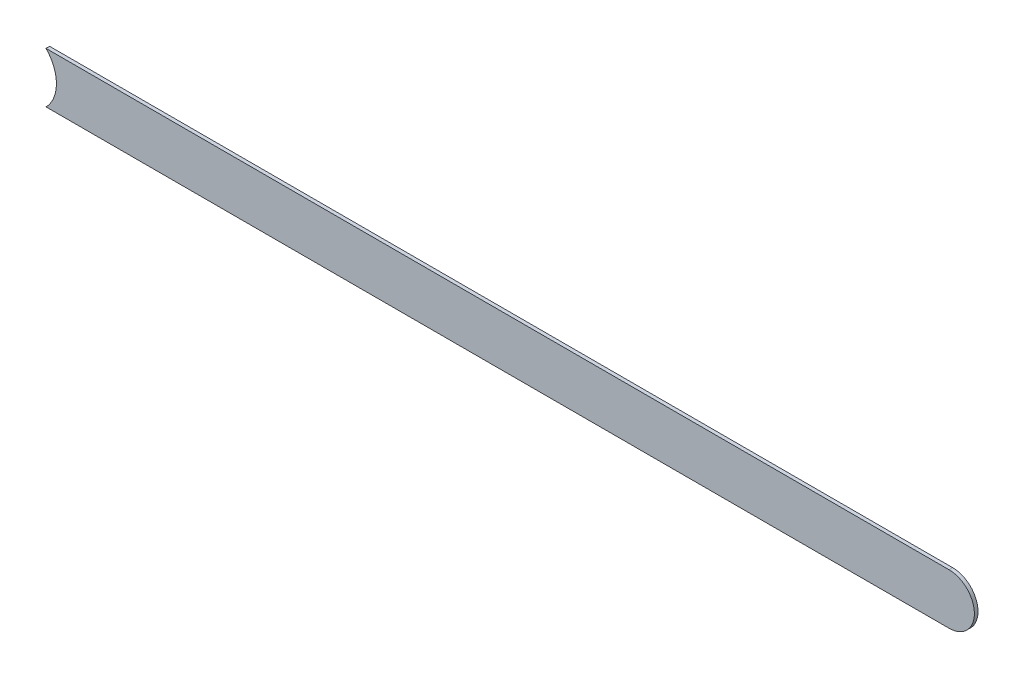
ISO-10303-21;
HEADER;
FILE_DESCRIPTION(('STEP AP214'),'2;1');
FILE_NAME('part.step','',(''),(''),'','','');
FILE_SCHEMA(('AUTOMOTIVE_DESIGN { 1 0 10303 214 1 1 1 1 }'));
ENDSEC;
DATA;
#1=APPLICATION_CONTEXT('core data for automotive mechanical design processes');
#2=APPLICATION_PROTOCOL_DEFINITION('international standard','automotive_design',2000,#1);
#3=PRODUCT_CONTEXT('',#1,'mechanical');
#4=PRODUCT('Part','Part','',(#3));
#5=PRODUCT_RELATED_PRODUCT_CATEGORY('part','',(#4));
#6=PRODUCT_DEFINITION_FORMATION('','',#4);
#7=PRODUCT_DEFINITION_CONTEXT('part definition',#1,'design');
#8=PRODUCT_DEFINITION('design','',#6,#7);
#9=PRODUCT_DEFINITION_SHAPE('','',#8);
#10=(LENGTH_UNIT() NAMED_UNIT(*) SI_UNIT(.MILLI.,.METRE.));
#11=(NAMED_UNIT(*) PLANE_ANGLE_UNIT() SI_UNIT($,.RADIAN.));
#12=(NAMED_UNIT(*) SI_UNIT($,.STERADIAN.) SOLID_ANGLE_UNIT());
#13=UNCERTAINTY_MEASURE_WITH_UNIT(LENGTH_MEASURE(1.E-05),#10,'distance_accuracy_value','');
#14=(GEOMETRIC_REPRESENTATION_CONTEXT(3) GLOBAL_UNCERTAINTY_ASSIGNED_CONTEXT((#13)) GLOBAL_UNIT_ASSIGNED_CONTEXT((#10,
#11,#12)) REPRESENTATION_CONTEXT('',''));
#15=CARTESIAN_POINT('',(0.,0.,0.));
#16=DIRECTION('',(0.,0.,1.));
#17=DIRECTION('',(1.,0.,0.));
#18=AXIS2_PLACEMENT_3D('',#15,#16,#17);
#19=CARTESIAN_POINT('',(48.1528872755931,65.25000158,0.));
#20=DIRECTION('',(0.,1.,0.));
#21=DIRECTION('',(1.,0.,0.));
#22=AXIS2_PLACEMENT_3D('',#19,#20,#21);
#23=PLANE('',#22);
#24=DIRECTION('',(1.,0.,0.));
#25=VECTOR('',#24,1.);
#26=CARTESIAN_POINT('',(47.90000072,65.25000158,0.03556));
#27=LINE('',#26,#25);
#28=CARTESIAN_POINT('',(48.1528872755931,65.25000158,0.03556));
#29=VERTEX_POINT('',#28);
#30=CARTESIAN_POINT('',(57.06002812,65.25000158,0.03556));
#31=VERTEX_POINT('',#30);
#32=EDGE_CURVE('E11',#29,#31,#27,.T.);
#33=ORIENTED_EDGE('',*,*,#32,.F.);
#34=DIRECTION('',(0.,0.,1.));
#35=VECTOR('',#34,1.);
#36=CARTESIAN_POINT('',(48.1528872755931,65.25000158,0.));
#37=LINE('',#36,#35);
#38=CARTESIAN_POINT('',(48.1528872755931,65.25000158,0.));
#39=VERTEX_POINT('',#38);
#40=EDGE_CURVE('E24',#39,#29,#37,.T.);
#41=ORIENTED_EDGE('',*,*,#40,.F.);
#42=DIRECTION('',(1.,0.,0.));
#43=VECTOR('',#42,1.);
#44=CARTESIAN_POINT('',(47.90000072,65.25000158,0.));
#45=LINE('',#44,#43);
#46=CARTESIAN_POINT('',(57.06002812,65.25000158,0.));
#47=VERTEX_POINT('',#46);
#48=EDGE_CURVE('E82',#39,#47,#45,.T.);
#49=ORIENTED_EDGE('',*,*,#48,.T.);
#50=DIRECTION('',(0.,0.,1.));
#51=VECTOR('',#50,1.);
#52=CARTESIAN_POINT('',(57.06002812,65.25000158,0.));
#53=LINE('',#52,#51);
#54=EDGE_CURVE('E37',#47,#31,#53,.T.);
#55=ORIENTED_EDGE('',*,*,#54,.T.);
#56=EDGE_LOOP('',(#33,#41,#49,#55));
#57=FACE_BOUND('',#56,.T.);
#58=ADVANCED_FACE('F17',(#57),#23,.F.);
#59=CARTESIAN_POINT('',(57.06002812,65.50000108,0.));
#60=DIRECTION('',(0.,0.,-1.));
#61=DIRECTION('',(0.,-1.,0.));
#62=AXIS2_PLACEMENT_3D('',#59,#60,#61);
#63=CYLINDRICAL_SURFACE('',#62,0.249999500000001);
#64=CARTESIAN_POINT('',(57.06002812,65.50000108,0.03556));
#65=DIRECTION('',(0.,0.,1.));
#66=DIRECTION('',(0.,-1.,0.));
#67=AXIS2_PLACEMENT_3D('',#64,#65,#66);
#68=CIRCLE('',#67,0.249999500000001);
#69=CARTESIAN_POINT('',(57.06002812,65.75000058,0.03556));
#70=VERTEX_POINT('',#69);
#71=EDGE_CURVE('E97',#31,#70,#68,.T.);
#72=ORIENTED_EDGE('',*,*,#71,.F.);
#73=ORIENTED_EDGE('',*,*,#54,.F.);
#74=CARTESIAN_POINT('',(57.06002812,65.50000108,0.));
#75=DIRECTION('',(0.,0.,1.));
#76=DIRECTION('',(0.,-1.,0.));
#77=AXIS2_PLACEMENT_3D('',#74,#75,#76);
#78=CIRCLE('',#77,0.249999500000001);
#79=CARTESIAN_POINT('',(57.06002812,65.75000058,0.));
#80=VERTEX_POINT('',#79);
#81=EDGE_CURVE('E94',#47,#80,#78,.T.);
#82=ORIENTED_EDGE('',*,*,#81,.T.);
#83=DIRECTION('',(0.,0.,1.));
#84=VECTOR('',#83,1.);
#85=CARTESIAN_POINT('',(57.06002812,65.75000058,0.));
#86=LINE('',#85,#84);
#87=EDGE_CURVE('E92',#80,#70,#86,.T.);
#88=ORIENTED_EDGE('',*,*,#87,.T.);
#89=EDGE_LOOP('',(#72,#73,#82,#88));
#90=FACE_BOUND('',#89,.T.);
#91=ADVANCED_FACE('F103',(#90),#63,.T.);
#92=CARTESIAN_POINT('',(57.06002812,65.75000058,0.));
#93=DIRECTION('',(0.,-1.,0.));
#94=DIRECTION('',(-1.,0.,0.));
#95=AXIS2_PLACEMENT_3D('',#92,#93,#94);
#96=PLANE('',#95);
#97=DIRECTION('',(-1.,0.,0.));
#98=VECTOR('',#97,1.);
#99=CARTESIAN_POINT('',(57.06002812,65.75000058,0.03556));
#100=LINE('',#99,#98);
#101=CARTESIAN_POINT('',(48.1528872755931,65.75000058,0.03556));
#102=VERTEX_POINT('',#101);
#103=EDGE_CURVE('E89',#70,#102,#100,.T.);
#104=ORIENTED_EDGE('',*,*,#103,.F.);
#105=ORIENTED_EDGE('',*,*,#87,.F.);
#106=DIRECTION('',(-1.,0.,0.));
#107=VECTOR('',#106,1.);
#108=CARTESIAN_POINT('',(57.06002812,65.75000058,0.));
#109=LINE('',#108,#107);
#110=CARTESIAN_POINT('',(48.1528872755931,65.75000058,0.));
#111=VERTEX_POINT('',#110);
#112=EDGE_CURVE('E87',#80,#111,#109,.T.);
#113=ORIENTED_EDGE('',*,*,#112,.T.);
#114=DIRECTION('',(0.,0.,1.));
#115=VECTOR('',#114,1.);
#116=CARTESIAN_POINT('',(48.1528872755931,65.75000058,0.));
#117=LINE('',#116,#115);
#118=EDGE_CURVE('E69',#111,#102,#117,.T.);
#119=ORIENTED_EDGE('',*,*,#118,.T.);
#120=EDGE_LOOP('',(#104,#105,#113,#119));
#121=FACE_BOUND('',#120,.T.);
#122=ADVANCED_FACE('F108',(#121),#96,.F.);
#123=CARTESIAN_POINT('',(47.90000072,65.50000108,0.));
#124=DIRECTION('',(0.,0.,-1.));
#125=DIRECTION('',(1.,0.,0.));
#126=AXIS2_PLACEMENT_3D('',#123,#124,#125);
#127=CYLINDRICAL_SURFACE('',#126,0.3556);
#128=DIRECTION('',(0.,0.,1.));
#129=VECTOR('',#128,1.);
#130=CARTESIAN_POINT('',(48.25560072,65.50000108,0.));
#131=LINE('',#130,#129);
#132=CARTESIAN_POINT('',(48.25560072,65.50000108,0.));
#133=VERTEX_POINT('',#132);
#134=CARTESIAN_POINT('',(48.25560072,65.50000108,0.03556));
#135=VERTEX_POINT('',#134);
#136=EDGE_CURVE('E59',#133,#135,#131,.T.);
#137=ORIENTED_EDGE('',*,*,#136,.T.);
#138=CARTESIAN_POINT('',(47.90000072,65.50000108,0.03556));
#139=DIRECTION('',(0.,0.,1.));
#140=DIRECTION('',(1.,0.,0.));
#141=AXIS2_PLACEMENT_3D('',#138,#139,#140);
#142=CIRCLE('',#141,0.3556);
#143=EDGE_CURVE('E70',#135,#102,#142,.T.);
#144=ORIENTED_EDGE('',*,*,#143,.T.);
#145=ORIENTED_EDGE('',*,*,#118,.F.);
#146=CARTESIAN_POINT('',(47.90000072,65.50000108,0.));
#147=DIRECTION('',(0.,0.,1.));
#148=DIRECTION('',(1.,0.,0.));
#149=AXIS2_PLACEMENT_3D('',#146,#147,#148);
#150=CIRCLE('',#149,0.3556);
#151=EDGE_CURVE('E73',#133,#111,#150,.T.);
#152=ORIENTED_EDGE('',*,*,#151,.F.);
#153=EDGE_LOOP('',(#137,#144,#145,#152));
#154=FACE_BOUND('',#153,.T.);
#155=ADVANCED_FACE('F74',(#154),#127,.F.);
#156=CARTESIAN_POINT('',(47.90000072,65.50000108,0.));
#157=DIRECTION('',(0.,0.,-1.));
#158=DIRECTION('',(1.,0.,0.));
#159=AXIS2_PLACEMENT_3D('',#156,#157,#158);
#160=CYLINDRICAL_SURFACE('',#159,0.3556);
#161=ORIENTED_EDGE('',*,*,#40,.T.);
#162=CARTESIAN_POINT('',(47.90000072,65.50000108,0.03556));
#163=DIRECTION('',(0.,0.,1.));
#164=DIRECTION('',(1.,0.,0.));
#165=AXIS2_PLACEMENT_3D('',#162,#163,#164);
#166=CIRCLE('',#165,0.3556);
#167=EDGE_CURVE('E65',#29,#135,#166,.T.);
#168=ORIENTED_EDGE('',*,*,#167,.T.);
#169=ORIENTED_EDGE('',*,*,#136,.F.);
#170=EDGE_CURVE('E63',#39,#133,#150,.T.);
#171=ORIENTED_EDGE('',*,*,#170,.F.);
#172=EDGE_LOOP('',(#161,#168,#169,#171));
#173=FACE_BOUND('',#172,.T.);
#174=ADVANCED_FACE('F61',(#173),#160,.F.);
#175=CARTESIAN_POINT('',(47.90000072,65.25000158,0.));
#176=DIRECTION('',(0.,0.,-1.));
#177=DIRECTION('',(-1.,0.,0.));
#178=AXIS2_PLACEMENT_3D('',#175,#176,#177);
#179=PLANE('',#178);
#180=ORIENTED_EDGE('',*,*,#48,.F.);
#181=ORIENTED_EDGE('',*,*,#170,.T.);
#182=ORIENTED_EDGE('',*,*,#151,.T.);
#183=ORIENTED_EDGE('',*,*,#112,.F.);
#184=ORIENTED_EDGE('',*,*,#81,.F.);
#185=EDGE_LOOP('',(#180,#181,#182,#183,#184));
#186=FACE_BOUND('',#185,.T.);
#187=ADVANCED_FACE('F80',(#186),#179,.T.);
#188=CARTESIAN_POINT('',(47.90000072,65.25000158,0.03556));
#189=DIRECTION('',(0.,0.,-1.));
#190=DIRECTION('',(-1.,0.,0.));
#191=AXIS2_PLACEMENT_3D('',#188,#189,#190);
#192=PLANE('',#191);
#193=ORIENTED_EDGE('',*,*,#167,.F.);
#194=ORIENTED_EDGE('',*,*,#32,.T.);
#195=ORIENTED_EDGE('',*,*,#71,.T.);
#196=ORIENTED_EDGE('',*,*,#103,.T.);
#197=ORIENTED_EDGE('',*,*,#143,.F.);
#198=EDGE_LOOP('',(#193,#194,#195,#196,#197));
#199=FACE_BOUND('',#198,.T.);
#200=ADVANCED_FACE('F106',(#199),#192,.F.);
#201=CLOSED_SHELL('',(#58,#91,#122,#155,#174,#187,#200));
#202=MANIFOLD_SOLID_BREP('B1',#201);
#203=ADVANCED_BREP_SHAPE_REPRESENTATION('',(#18,#202),#14);
#204=SHAPE_DEFINITION_REPRESENTATION(#9,#203);
ENDSEC;
END-ISO-10303-21;
